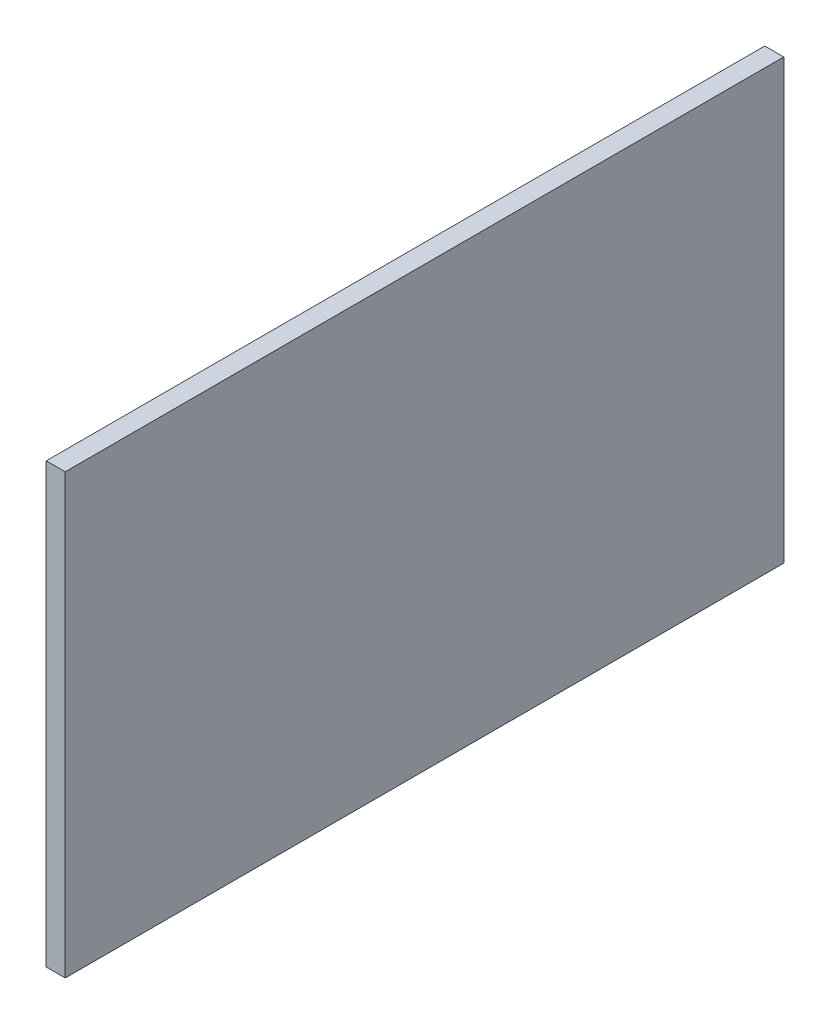
ISO-10303-21;
HEADER;
FILE_DESCRIPTION(('STEP AP214'),'2;1');
FILE_NAME('part.step','',(''),(''),'','','');
FILE_SCHEMA(('AUTOMOTIVE_DESIGN { 1 0 10303 214 1 1 1 1 }'));
ENDSEC;
DATA;
#1=APPLICATION_CONTEXT('core data for automotive mechanical design processes');
#2=APPLICATION_PROTOCOL_DEFINITION('international standard','automotive_design',2000,#1);
#3=PRODUCT_CONTEXT('',#1,'mechanical');
#4=PRODUCT('Part','Part','',(#3));
#5=PRODUCT_RELATED_PRODUCT_CATEGORY('part','',(#4));
#6=PRODUCT_DEFINITION_FORMATION('','',#4);
#7=PRODUCT_DEFINITION_CONTEXT('part definition',#1,'design');
#8=PRODUCT_DEFINITION('design','',#6,#7);
#9=PRODUCT_DEFINITION_SHAPE('','',#8);
#10=(LENGTH_UNIT() NAMED_UNIT(*) SI_UNIT(.MILLI.,.METRE.));
#11=(NAMED_UNIT(*) PLANE_ANGLE_UNIT() SI_UNIT($,.RADIAN.));
#12=(NAMED_UNIT(*) SI_UNIT($,.STERADIAN.) SOLID_ANGLE_UNIT());
#13=UNCERTAINTY_MEASURE_WITH_UNIT(LENGTH_MEASURE(1.E-05),#10,'distance_accuracy_value','');
#14=(GEOMETRIC_REPRESENTATION_CONTEXT(3) GLOBAL_UNCERTAINTY_ASSIGNED_CONTEXT((#13)) GLOBAL_UNIT_ASSIGNED_CONTEXT((#10,
#11,#12)) REPRESENTATION_CONTEXT('',''));
#15=CARTESIAN_POINT('',(0.,0.,0.));
#16=DIRECTION('',(0.,0.,1.));
#17=DIRECTION('',(1.,0.,0.));
#18=AXIS2_PLACEMENT_3D('',#15,#16,#17);
#19=CARTESIAN_POINT('',(12.,0.,0.));
#20=DIRECTION('',(0.,0.,-1.));
#21=DIRECTION('',(-1.,0.,0.));
#22=AXIS2_PLACEMENT_3D('',#19,#20,#21);
#23=PLANE('',#22);
#24=DIRECTION('',(0.,-1.,0.));
#25=VECTOR('',#24,1.);
#26=CARTESIAN_POINT('',(0.,0.,0.));
#27=LINE('',#26,#25);
#28=CARTESIAN_POINT('',(0.,277.,0.));
#29=VERTEX_POINT('',#28);
#30=CARTESIAN_POINT('',(0.,0.,0.));
#31=VERTEX_POINT('',#30);
#32=EDGE_CURVE('E96',#29,#31,#27,.T.);
#33=ORIENTED_EDGE('',*,*,#32,.T.);
#34=DIRECTION('',(-1.,0.,0.));
#35=VECTOR('',#34,1.);
#36=CARTESIAN_POINT('',(12.,0.,0.));
#37=LINE('',#36,#35);
#38=CARTESIAN_POINT('',(12.,0.,0.));
#39=VERTEX_POINT('',#38);
#40=EDGE_CURVE('E11',#39,#31,#37,.T.);
#41=ORIENTED_EDGE('',*,*,#40,.F.);
#42=DIRECTION('',(0.,-1.,0.));
#43=VECTOR('',#42,1.);
#44=CARTESIAN_POINT('',(12.,0.,0.));
#45=LINE('',#44,#43);
#46=CARTESIAN_POINT('',(12.,277.,0.));
#47=VERTEX_POINT('',#46);
#48=EDGE_CURVE('E84',#47,#39,#45,.T.);
#49=ORIENTED_EDGE('',*,*,#48,.F.);
#50=DIRECTION('',(-1.,0.,0.));
#51=VECTOR('',#50,1.);
#52=CARTESIAN_POINT('',(12.,277.,0.));
#53=LINE('',#52,#51);
#54=EDGE_CURVE('E92',#47,#29,#53,.T.);
#55=ORIENTED_EDGE('',*,*,#54,.T.);
#56=EDGE_LOOP('',(#33,#41,#49,#55));
#57=FACE_BOUND('',#56,.T.);
#58=ADVANCED_FACE('F33',(#57),#23,.F.);
#59=CARTESIAN_POINT('',(12.,0.,0.));
#60=DIRECTION('',(0.,1.,0.));
#61=DIRECTION('',(0.,0.,1.));
#62=AXIS2_PLACEMENT_3D('',#59,#60,#61);
#63=PLANE('',#62);
#64=DIRECTION('',(0.,0.,-1.));
#65=VECTOR('',#64,1.);
#66=CARTESIAN_POINT('',(0.,0.,0.));
#67=LINE('',#66,#65);
#68=CARTESIAN_POINT('',(0.,0.,-454.));
#69=VERTEX_POINT('',#68);
#70=EDGE_CURVE('E88',#31,#69,#67,.T.);
#71=ORIENTED_EDGE('',*,*,#70,.T.);
#72=DIRECTION('',(-1.,0.,0.));
#73=VECTOR('',#72,1.);
#74=CARTESIAN_POINT('',(12.,0.,-454.));
#75=LINE('',#74,#73);
#76=CARTESIAN_POINT('',(12.,0.,-454.));
#77=VERTEX_POINT('',#76);
#78=EDGE_CURVE('E41',#77,#69,#75,.T.);
#79=ORIENTED_EDGE('',*,*,#78,.F.);
#80=DIRECTION('',(0.,0.,-1.));
#81=VECTOR('',#80,1.);
#82=CARTESIAN_POINT('',(12.,0.,0.));
#83=LINE('',#82,#81);
#84=EDGE_CURVE('E79',#39,#77,#83,.T.);
#85=ORIENTED_EDGE('',*,*,#84,.F.);
#86=ORIENTED_EDGE('',*,*,#40,.T.);
#87=EDGE_LOOP('',(#71,#79,#85,#86));
#88=FACE_BOUND('',#87,.T.);
#89=ADVANCED_FACE('F87',(#88),#63,.F.);
#90=CARTESIAN_POINT('',(12.,0.,-454.));
#91=DIRECTION('',(0.,0.,1.));
#92=DIRECTION('',(1.,0.,0.));
#93=AXIS2_PLACEMENT_3D('',#90,#91,#92);
#94=PLANE('',#93);
#95=DIRECTION('',(0.,1.,0.));
#96=VECTOR('',#95,1.);
#97=CARTESIAN_POINT('',(0.,0.,-454.));
#98=LINE('',#97,#96);
#99=CARTESIAN_POINT('',(0.,277.,-454.));
#100=VERTEX_POINT('',#99);
#101=EDGE_CURVE('E66',#69,#100,#98,.T.);
#102=ORIENTED_EDGE('',*,*,#101,.T.);
#103=DIRECTION('',(-1.,0.,0.));
#104=VECTOR('',#103,1.);
#105=CARTESIAN_POINT('',(12.,277.,-454.));
#106=LINE('',#105,#104);
#107=CARTESIAN_POINT('',(12.,277.,-454.));
#108=VERTEX_POINT('',#107);
#109=EDGE_CURVE('E89',#108,#100,#106,.T.);
#110=ORIENTED_EDGE('',*,*,#109,.F.);
#111=DIRECTION('',(0.,1.,0.));
#112=VECTOR('',#111,1.);
#113=CARTESIAN_POINT('',(12.,0.,-454.));
#114=LINE('',#113,#112);
#115=EDGE_CURVE('E82',#77,#108,#114,.T.);
#116=ORIENTED_EDGE('',*,*,#115,.F.);
#117=ORIENTED_EDGE('',*,*,#78,.T.);
#118=EDGE_LOOP('',(#102,#110,#116,#117));
#119=FACE_BOUND('',#118,.T.);
#120=ADVANCED_FACE('F90',(#119),#94,.F.);
#121=CARTESIAN_POINT('',(12.,277.,0.));
#122=DIRECTION('',(0.,-1.,0.));
#123=DIRECTION('',(0.,0.,-1.));
#124=AXIS2_PLACEMENT_3D('',#121,#122,#123);
#125=PLANE('',#124);
#126=DIRECTION('',(0.,0.,1.));
#127=VECTOR('',#126,1.);
#128=CARTESIAN_POINT('',(0.,277.,0.));
#129=LINE('',#128,#127);
#130=EDGE_CURVE('E72',#100,#29,#129,.T.);
#131=ORIENTED_EDGE('',*,*,#130,.T.);
#132=ORIENTED_EDGE('',*,*,#54,.F.);
#133=DIRECTION('',(0.,0.,1.));
#134=VECTOR('',#133,1.);
#135=CARTESIAN_POINT('',(12.,277.,0.));
#136=LINE('',#135,#134);
#137=EDGE_CURVE('E49',#108,#47,#136,.T.);
#138=ORIENTED_EDGE('',*,*,#137,.F.);
#139=ORIENTED_EDGE('',*,*,#109,.T.);
#140=EDGE_LOOP('',(#131,#132,#138,#139));
#141=FACE_BOUND('',#140,.T.);
#142=ADVANCED_FACE('F103',(#141),#125,.F.);
#143=CARTESIAN_POINT('',(12.,0.,0.));
#144=DIRECTION('',(-1.,0.,0.));
#145=DIRECTION('',(0.,0.,1.));
#146=AXIS2_PLACEMENT_3D('',#143,#144,#145);
#147=PLANE('',#146);
#148=ORIENTED_EDGE('',*,*,#48,.T.);
#149=ORIENTED_EDGE('',*,*,#84,.T.);
#150=ORIENTED_EDGE('',*,*,#115,.T.);
#151=ORIENTED_EDGE('',*,*,#137,.T.);
#152=EDGE_LOOP('',(#148,#149,#150,#151));
#153=FACE_BOUND('',#152,.T.);
#154=ADVANCED_FACE('F80',(#153),#147,.F.);
#155=CARTESIAN_POINT('',(0.,0.,0.));
#156=DIRECTION('',(-1.,0.,0.));
#157=DIRECTION('',(0.,0.,1.));
#158=AXIS2_PLACEMENT_3D('',#155,#156,#157);
#159=PLANE('',#158);
#160=ORIENTED_EDGE('',*,*,#32,.F.);
#161=ORIENTED_EDGE('',*,*,#130,.F.);
#162=ORIENTED_EDGE('',*,*,#101,.F.);
#163=ORIENTED_EDGE('',*,*,#70,.F.);
#164=EDGE_LOOP('',(#160,#161,#162,#163));
#165=FACE_BOUND('',#164,.T.);
#166=ADVANCED_FACE('F106',(#165),#159,.T.);
#167=CLOSED_SHELL('',(#58,#89,#120,#142,#154,#166));
#168=MANIFOLD_SOLID_BREP('B2',#167);
#169=ADVANCED_BREP_SHAPE_REPRESENTATION('',(#18,#168),#14);
#170=SHAPE_DEFINITION_REPRESENTATION(#9,#169);
ENDSEC;
END-ISO-10303-21;
